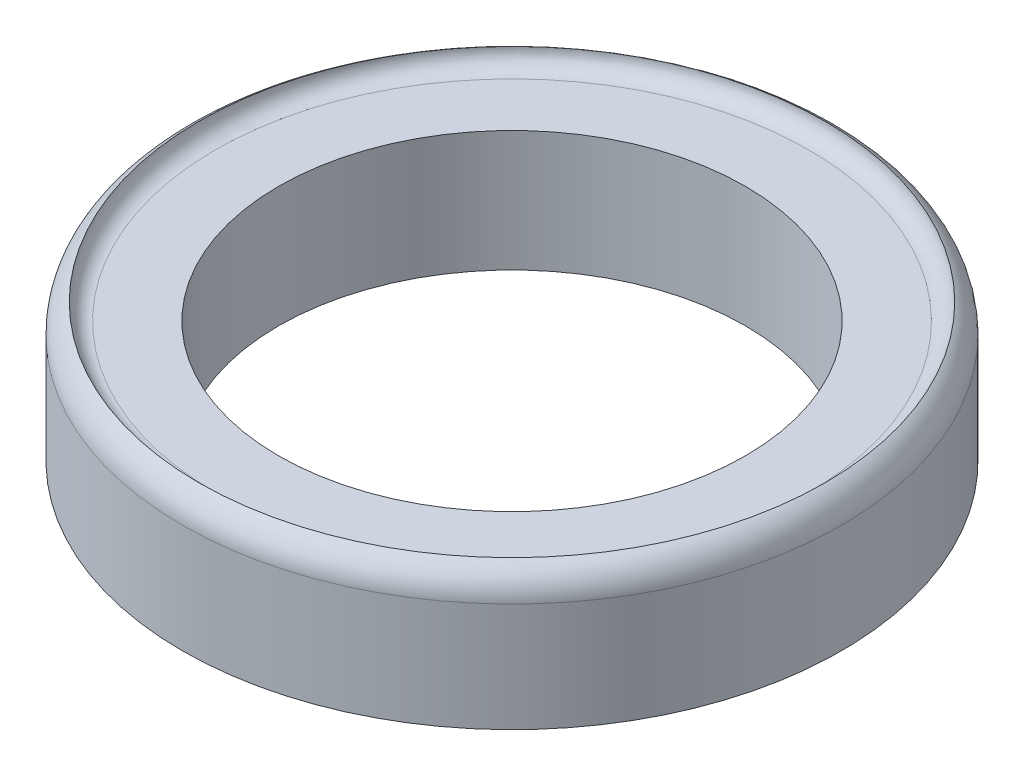
ISO-10303-21;
HEADER;
FILE_DESCRIPTION(('STEP AP214'),'2;1');
FILE_NAME('part.step','',(''),(''),'','','');
FILE_SCHEMA(('AUTOMOTIVE_DESIGN { 1 0 10303 214 1 1 1 1 }'));
ENDSEC;
DATA;
#1=APPLICATION_CONTEXT('core data for automotive mechanical design processes');
#2=APPLICATION_PROTOCOL_DEFINITION('international standard','automotive_design',2000,#1);
#3=PRODUCT_CONTEXT('',#1,'mechanical');
#4=PRODUCT('Part','Part','',(#3));
#5=PRODUCT_RELATED_PRODUCT_CATEGORY('part','',(#4));
#6=PRODUCT_DEFINITION_FORMATION('','',#4);
#7=PRODUCT_DEFINITION_CONTEXT('part definition',#1,'design');
#8=PRODUCT_DEFINITION('design','',#6,#7);
#9=PRODUCT_DEFINITION_SHAPE('','',#8);
#10=(LENGTH_UNIT() NAMED_UNIT(*) SI_UNIT(.MILLI.,.METRE.));
#11=(NAMED_UNIT(*) PLANE_ANGLE_UNIT() SI_UNIT($,.RADIAN.));
#12=(NAMED_UNIT(*) SI_UNIT($,.STERADIAN.) SOLID_ANGLE_UNIT());
#13=UNCERTAINTY_MEASURE_WITH_UNIT(LENGTH_MEASURE(1.E-05),#10,'distance_accuracy_value','');
#14=(GEOMETRIC_REPRESENTATION_CONTEXT(3) GLOBAL_UNCERTAINTY_ASSIGNED_CONTEXT((#13)) GLOBAL_UNIT_ASSIGNED_CONTEXT((#10,
#11,#12)) REPRESENTATION_CONTEXT('',''));
#15=CARTESIAN_POINT('',(0.,0.,0.));
#16=DIRECTION('',(0.,0.,1.));
#17=DIRECTION('',(1.,0.,0.));
#18=AXIS2_PLACEMENT_3D('',#15,#16,#17);
#19=CARTESIAN_POINT('',(0.,8.8,0.));
#20=DIRECTION('',(0.,-1.,0.));
#21=DIRECTION('',(0.,0.,-1.));
#22=AXIS2_PLACEMENT_3D('',#19,#20,#21);
#23=CYLINDRICAL_SURFACE('',#22,17.);
#24=CARTESIAN_POINT('',(0.,8.8,0.));
#25=DIRECTION('',(0.,1.,0.));
#26=DIRECTION('',(0.,0.,1.));
#27=AXIS2_PLACEMENT_3D('',#24,#25,#26);
#28=CIRCLE('',#27,17.);
#29=CARTESIAN_POINT('',(0.,8.8,17.));
#30=VERTEX_POINT('',#29);
#31=EDGE_CURVE('E52',#30,#30,#28,.T.);
#32=ORIENTED_EDGE('',*,*,#31,.T.);
#33=EDGE_LOOP('',(#32));
#34=FACE_BOUND('',#33,.T.);
#35=CARTESIAN_POINT('',(0.,0.,0.));
#36=DIRECTION('',(0.,1.,0.));
#37=DIRECTION('',(0.,0.,1.));
#38=AXIS2_PLACEMENT_3D('',#35,#36,#37);
#39=CIRCLE('',#38,17.);
#40=CARTESIAN_POINT('',(0.,0.,17.));
#41=VERTEX_POINT('',#40);
#42=EDGE_CURVE('E57',#41,#41,#39,.T.);
#43=ORIENTED_EDGE('',*,*,#42,.F.);
#44=EDGE_LOOP('',(#43));
#45=FACE_BOUND('',#44,.T.);
#46=ADVANCED_FACE('F39',(#34,#45),#23,.F.);
#47=CARTESIAN_POINT('',(0.,8.8,0.));
#48=DIRECTION('',(0.,1.,0.));
#49=DIRECTION('',(0.,0.,1.));
#50=AXIS2_PLACEMENT_3D('',#47,#48,#49);
#51=PLANE('',#50);
#52=CARTESIAN_POINT('',(0.,8.8,0.));
#53=DIRECTION('',(0.,1.,0.));
#54=DIRECTION('',(0.,0.,1.));
#55=AXIS2_PLACEMENT_3D('',#52,#53,#54);
#56=CIRCLE('',#55,21.6);
#57=CARTESIAN_POINT('',(0.,8.8,21.6));
#58=VERTEX_POINT('',#57);
#59=EDGE_CURVE('E47',#58,#58,#56,.T.);
#60=ORIENTED_EDGE('',*,*,#59,.T.);
#61=EDGE_LOOP('',(#60));
#62=FACE_BOUND('',#61,.T.);
#63=ORIENTED_EDGE('',*,*,#31,.F.);
#64=EDGE_LOOP('',(#63));
#65=FACE_BOUND('',#64,.T.);
#66=ADVANCED_FACE('F82',(#62,#65),#51,.T.);
#67=CARTESIAN_POINT('',(0.,0.,0.));
#68=DIRECTION('',(0.,1.,0.));
#69=DIRECTION('',(0.,0.,1.));
#70=AXIS2_PLACEMENT_3D('',#67,#68,#69);
#71=PLANE('',#70);
#72=ORIENTED_EDGE('',*,*,#42,.T.);
#73=EDGE_LOOP('',(#72));
#74=FACE_BOUND('',#73,.T.);
#75=CARTESIAN_POINT('',(0.,0.,0.));
#76=DIRECTION('',(0.,1.,0.));
#77=DIRECTION('',(0.,0.,1.));
#78=AXIS2_PLACEMENT_3D('',#75,#76,#77);
#79=CIRCLE('',#78,24.);
#80=CARTESIAN_POINT('',(0.,0.,24.));
#81=VERTEX_POINT('',#80);
#82=EDGE_CURVE('E64',#81,#81,#79,.T.);
#83=ORIENTED_EDGE('',*,*,#82,.F.);
#84=EDGE_LOOP('',(#83));
#85=FACE_BOUND('',#84,.T.);
#86=ADVANCED_FACE('F88',(#74,#85),#71,.F.);
#87=CARTESIAN_POINT('',(0.,10.,0.));
#88=DIRECTION('',(0.,-1.,0.));
#89=DIRECTION('',(0.,0.,-1.));
#90=AXIS2_PLACEMENT_3D('',#87,#88,#89);
#91=CYLINDRICAL_SURFACE('',#90,24.);
#92=CARTESIAN_POINT('',(0.,7.92153903091735,0.));
#93=DIRECTION('',(0.,1.,0.));
#94=DIRECTION('',(0.,0.,1.));
#95=AXIS2_PLACEMENT_3D('',#92,#93,#94);
#96=CIRCLE('',#95,24.);
#97=CARTESIAN_POINT('',(0.,7.92153903091735,24.));
#98=VERTEX_POINT('',#97);
#99=EDGE_CURVE('E10',#98,#98,#96,.F.);
#100=ORIENTED_EDGE('',*,*,#99,.T.);
#101=EDGE_LOOP('',(#100));
#102=FACE_BOUND('',#101,.T.);
#103=ORIENTED_EDGE('',*,*,#82,.T.);
#104=EDGE_LOOP('',(#103));
#105=FACE_BOUND('',#104,.T.);
#106=ADVANCED_FACE('F79',(#102,#105),#91,.T.);
#107=CARTESIAN_POINT('',(0.,10.,0.));
#108=DIRECTION('',(0.,1.,0.));
#109=DIRECTION('',(0.,0.,1.));
#110=AXIS2_PLACEMENT_3D('',#107,#108,#109);
#111=TOROIDAL_SURFACE('',#110,21.6,1.2);
#112=ORIENTED_EDGE('',*,*,#59,.F.);
#113=EDGE_LOOP('',(#112));
#114=FACE_BOUND('',#113,.T.);
#115=CARTESIAN_POINT('',(0.,10.,0.));
#116=DIRECTION('',(0.,1.,0.));
#117=DIRECTION('',(0.,0.,1.));
#118=AXIS2_PLACEMENT_3D('',#115,#116,#117);
#119=CIRCLE('',#118,22.8);
#120=CARTESIAN_POINT('',(0.,10.,22.8));
#121=VERTEX_POINT('',#120);
#122=EDGE_CURVE('E62',#121,#121,#119,.T.);
#123=ORIENTED_EDGE('',*,*,#122,.T.);
#124=EDGE_LOOP('',(#123));
#125=FACE_BOUND('',#124,.T.);
#126=ADVANCED_FACE('F72',(#114,#125),#111,.F.);
#127=CARTESIAN_POINT('',(0.,7.92153903091735,0.));
#128=DIRECTION('',(0.,1.,0.));
#129=DIRECTION('',(0.,0.,1.));
#130=AXIS2_PLACEMENT_3D('',#127,#128,#129);
#131=TOROIDAL_SURFACE('',#130,21.6,2.4);
#132=ORIENTED_EDGE('',*,*,#99,.F.);
#133=EDGE_LOOP('',(#132));
#134=FACE_BOUND('',#133,.T.);
#135=ORIENTED_EDGE('',*,*,#122,.F.);
#136=EDGE_LOOP('',(#135));
#137=FACE_BOUND('',#136,.T.);
#138=ADVANCED_FACE('F41',(#134,#137),#131,.T.);
#139=CLOSED_SHELL('',(#46,#66,#86,#106,#126,#138));
#140=MANIFOLD_SOLID_BREP('B2',#139);
#141=ADVANCED_BREP_SHAPE_REPRESENTATION('',(#18,#140),#14);
#142=SHAPE_DEFINITION_REPRESENTATION(#9,#141);
ENDSEC;
END-ISO-10303-21;
